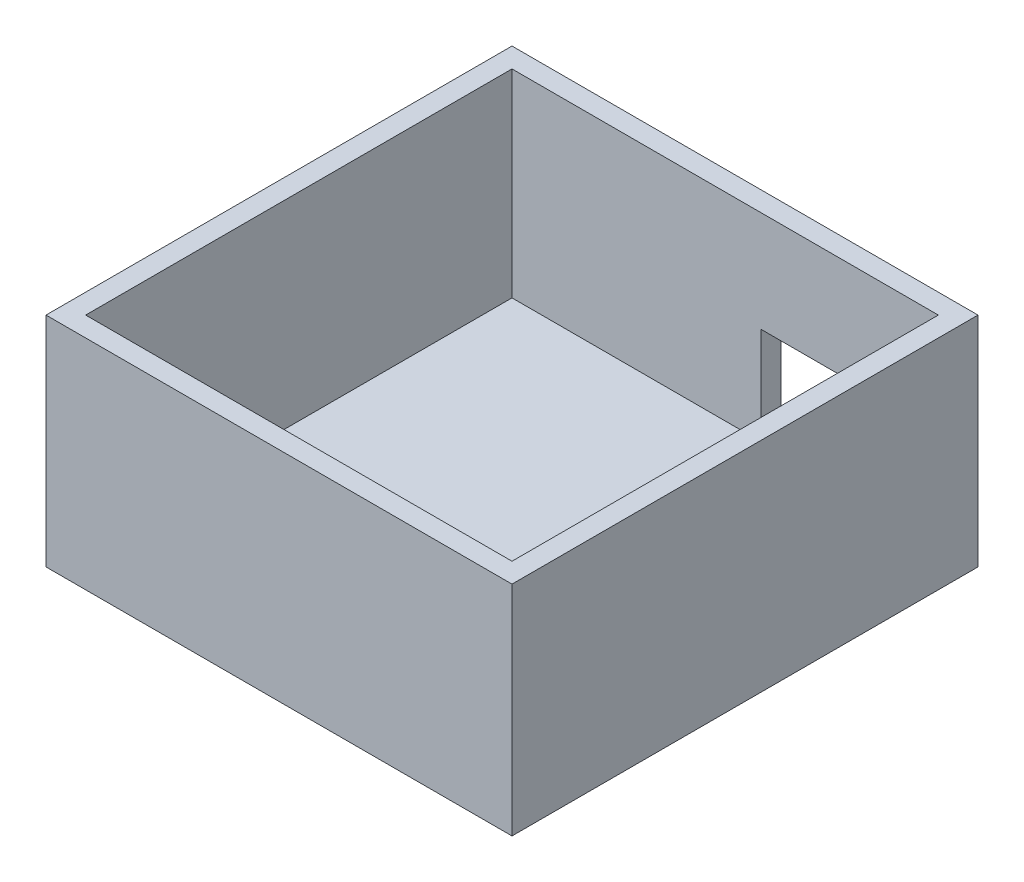
ISO-10303-21;
HEADER;
FILE_DESCRIPTION(('STEP AP214'),'2;1');
FILE_NAME('part.step','',(''),(''),'','','');
FILE_SCHEMA(('AUTOMOTIVE_DESIGN { 1 0 10303 214 1 1 1 1 }'));
ENDSEC;
DATA;
#1=APPLICATION_CONTEXT('core data for automotive mechanical design processes');
#2=APPLICATION_PROTOCOL_DEFINITION('international standard','automotive_design',2000,#1);
#3=PRODUCT_CONTEXT('',#1,'mechanical');
#4=PRODUCT('Part','Part','',(#3));
#5=PRODUCT_RELATED_PRODUCT_CATEGORY('part','',(#4));
#6=PRODUCT_DEFINITION_FORMATION('','',#4);
#7=PRODUCT_DEFINITION_CONTEXT('part definition',#1,'design');
#8=PRODUCT_DEFINITION('design','',#6,#7);
#9=PRODUCT_DEFINITION_SHAPE('','',#8);
#10=(LENGTH_UNIT() NAMED_UNIT(*) SI_UNIT(.MILLI.,.METRE.));
#11=(NAMED_UNIT(*) PLANE_ANGLE_UNIT() SI_UNIT($,.RADIAN.));
#12=(NAMED_UNIT(*) SI_UNIT($,.STERADIAN.) SOLID_ANGLE_UNIT());
#13=UNCERTAINTY_MEASURE_WITH_UNIT(LENGTH_MEASURE(1.E-05),#10,'distance_accuracy_value','');
#14=(GEOMETRIC_REPRESENTATION_CONTEXT(3) GLOBAL_UNCERTAINTY_ASSIGNED_CONTEXT((#13)) GLOBAL_UNIT_ASSIGNED_CONTEXT((#10,
#11,#12)) REPRESENTATION_CONTEXT('',''));
#15=CARTESIAN_POINT('',(0.,0.,0.));
#16=DIRECTION('',(0.,0.,1.));
#17=DIRECTION('',(1.,0.,0.));
#18=AXIS2_PLACEMENT_3D('',#15,#16,#17);
#19=CARTESIAN_POINT('',(0.,100.,-102.5));
#20=DIRECTION('',(0.,0.,-1.));
#21=DIRECTION('',(-1.,0.,0.));
#22=AXIS2_PLACEMENT_3D('',#19,#20,#21);
#23=PLANE('',#22);
#24=DIRECTION('',(-1.,0.,0.));
#25=VECTOR('',#24,1.);
#26=CARTESIAN_POINT('',(92.8750219372496,49.0699731582822,-102.5));
#27=LINE('',#26,#25);
#28=CARTESIAN_POINT('',(92.8750219372496,49.0699731582822,-102.5));
#29=VERTEX_POINT('',#28);
#30=CARTESIAN_POINT('',(18.1394624170998,49.0699731582822,-102.5));
#31=VERTEX_POINT('',#30);
#32=EDGE_CURVE('E129',#29,#31,#27,.T.);
#33=ORIENTED_EDGE('',*,*,#32,.F.);
#34=DIRECTION('',(0.,1.,0.));
#35=VECTOR('',#34,1.);
#36=CARTESIAN_POINT('',(92.8750219372496,49.0699731582822,-102.5));
#37=LINE('',#36,#35);
#38=CARTESIAN_POINT('',(92.8750219372496,8.69964188765948,-102.5));
#39=VERTEX_POINT('',#38);
#40=EDGE_CURVE('E136',#39,#29,#37,.T.);
#41=ORIENTED_EDGE('',*,*,#40,.F.);
#42=DIRECTION('',(1.,0.,0.));
#43=VECTOR('',#42,1.);
#44=CARTESIAN_POINT('',(92.8750219372496,8.69964188765948,-102.5));
#45=LINE('',#44,#43);
#46=CARTESIAN_POINT('',(18.1394624170998,8.69964188765948,-102.5));
#47=VERTEX_POINT('',#46);
#48=EDGE_CURVE('E141',#47,#39,#45,.T.);
#49=ORIENTED_EDGE('',*,*,#48,.F.);
#50=DIRECTION('',(0.,-1.,0.));
#51=VECTOR('',#50,1.);
#52=CARTESIAN_POINT('',(18.1394624170998,49.0699731582822,-102.5));
#53=LINE('',#52,#51);
#54=EDGE_CURVE('E51',#31,#47,#53,.T.);
#55=ORIENTED_EDGE('',*,*,#54,.F.);
#56=EDGE_LOOP('',(#33,#41,#49,#55));
#57=FACE_BOUND('',#56,.T.);
#58=DIRECTION('',(1.,0.,0.));
#59=VECTOR('',#58,1.);
#60=CARTESIAN_POINT('',(0.,0.,-102.5));
#61=LINE('',#60,#59);
#62=CARTESIAN_POINT('',(-107.5,0.,-102.5));
#63=VERTEX_POINT('',#62);
#64=CARTESIAN_POINT('',(107.5,0.,-102.5));
#65=VERTEX_POINT('',#64);
#66=EDGE_CURVE('E164',#63,#65,#61,.T.);
#67=ORIENTED_EDGE('',*,*,#66,.T.);
#68=DIRECTION('',(0.,-1.,0.));
#69=VECTOR('',#68,1.);
#70=CARTESIAN_POINT('',(107.5,100.,-102.5));
#71=LINE('',#70,#69);
#72=CARTESIAN_POINT('',(107.5,100.,-102.5));
#73=VERTEX_POINT('',#72);
#74=EDGE_CURVE('E11',#73,#65,#71,.T.);
#75=ORIENTED_EDGE('',*,*,#74,.F.);
#76=DIRECTION('',(1.,0.,0.));
#77=VECTOR('',#76,1.);
#78=CARTESIAN_POINT('',(0.,100.,-102.5));
#79=LINE('',#78,#77);
#80=CARTESIAN_POINT('',(-107.5,100.,-102.5));
#81=VERTEX_POINT('',#80);
#82=EDGE_CURVE('E177',#81,#73,#79,.T.);
#83=ORIENTED_EDGE('',*,*,#82,.F.);
#84=DIRECTION('',(0.,-1.,0.));
#85=VECTOR('',#84,1.);
#86=CARTESIAN_POINT('',(-107.5,100.,-102.5));
#87=LINE('',#86,#85);
#88=EDGE_CURVE('E197',#81,#63,#87,.T.);
#89=ORIENTED_EDGE('',*,*,#88,.T.);
#90=EDGE_LOOP('',(#67,#75,#83,#89));
#91=FACE_BOUND('',#90,.T.);
#92=ADVANCED_FACE('F34',(#57,#91),#23,.F.);
#93=CARTESIAN_POINT('',(107.5,100.,0.));
#94=DIRECTION('',(1.,0.,0.));
#95=DIRECTION('',(0.,0.,-1.));
#96=AXIS2_PLACEMENT_3D('',#93,#94,#95);
#97=PLANE('',#96);
#98=DIRECTION('',(0.,0.,1.));
#99=VECTOR('',#98,1.);
#100=CARTESIAN_POINT('',(107.5,0.,0.));
#101=LINE('',#100,#99);
#102=CARTESIAN_POINT('',(107.5,0.,112.5));
#103=VERTEX_POINT('',#102);
#104=EDGE_CURVE('E191',#65,#103,#101,.T.);
#105=ORIENTED_EDGE('',*,*,#104,.T.);
#106=DIRECTION('',(0.,-1.,0.));
#107=VECTOR('',#106,1.);
#108=CARTESIAN_POINT('',(107.5,100.,112.5));
#109=LINE('',#108,#107);
#110=CARTESIAN_POINT('',(107.5,100.,112.5));
#111=VERTEX_POINT('',#110);
#112=EDGE_CURVE('E43',#111,#103,#109,.T.);
#113=ORIENTED_EDGE('',*,*,#112,.F.);
#114=DIRECTION('',(0.,0.,1.));
#115=VECTOR('',#114,1.);
#116=CARTESIAN_POINT('',(107.5,100.,0.));
#117=LINE('',#116,#115);
#118=EDGE_CURVE('E180',#73,#111,#117,.T.);
#119=ORIENTED_EDGE('',*,*,#118,.F.);
#120=ORIENTED_EDGE('',*,*,#74,.T.);
#121=EDGE_LOOP('',(#105,#113,#119,#120));
#122=FACE_BOUND('',#121,.T.);
#123=ADVANCED_FACE('F239',(#122),#97,.F.);
#124=CARTESIAN_POINT('',(0.,100.,112.5));
#125=DIRECTION('',(0.,0.,-1.));
#126=DIRECTION('',(-1.,0.,0.));
#127=AXIS2_PLACEMENT_3D('',#124,#125,#126);
#128=PLANE('',#127);
#129=DIRECTION('',(1.,0.,0.));
#130=VECTOR('',#129,1.);
#131=CARTESIAN_POINT('',(0.,0.,112.5));
#132=LINE('',#131,#130);
#133=CARTESIAN_POINT('',(-107.5,0.,112.5));
#134=VERTEX_POINT('',#133);
#135=EDGE_CURVE('E194',#134,#103,#132,.T.);
#136=ORIENTED_EDGE('',*,*,#135,.F.);
#137=DIRECTION('',(0.,-1.,0.));
#138=VECTOR('',#137,1.);
#139=CARTESIAN_POINT('',(-107.5,100.,112.5));
#140=LINE('',#139,#138);
#141=CARTESIAN_POINT('',(-107.5,100.,112.5));
#142=VERTEX_POINT('',#141);
#143=EDGE_CURVE('E200',#142,#134,#140,.T.);
#144=ORIENTED_EDGE('',*,*,#143,.F.);
#145=DIRECTION('',(1.,0.,0.));
#146=VECTOR('',#145,1.);
#147=CARTESIAN_POINT('',(0.,100.,112.5));
#148=LINE('',#147,#146);
#149=EDGE_CURVE('E182',#142,#111,#148,.T.);
#150=ORIENTED_EDGE('',*,*,#149,.T.);
#151=ORIENTED_EDGE('',*,*,#112,.T.);
#152=EDGE_LOOP('',(#136,#144,#150,#151));
#153=FACE_BOUND('',#152,.T.);
#154=ADVANCED_FACE('F242',(#153),#128,.T.);
#155=CARTESIAN_POINT('',(117.5,100.,0.));
#156=DIRECTION('',(1.,0.,0.));
#157=DIRECTION('',(0.,0.,-1.));
#158=AXIS2_PLACEMENT_3D('',#155,#156,#157);
#159=PLANE('',#158);
#160=DIRECTION('',(0.,-1.,0.));
#161=VECTOR('',#160,1.);
#162=CARTESIAN_POINT('',(117.5,100.,122.5));
#163=LINE('',#162,#161);
#164=CARTESIAN_POINT('',(117.5,100.,122.5));
#165=VERTEX_POINT('',#164);
#166=CARTESIAN_POINT('',(117.5,-10.,122.5));
#167=VERTEX_POINT('',#166);
#168=EDGE_CURVE('E188',#165,#167,#163,.T.);
#169=ORIENTED_EDGE('',*,*,#168,.T.);
#170=DIRECTION('',(0.,0.,1.));
#171=VECTOR('',#170,1.);
#172=CARTESIAN_POINT('',(117.5,-10.,122.5));
#173=LINE('',#172,#171);
#174=CARTESIAN_POINT('',(117.5,-10.,-112.5));
#175=VERTEX_POINT('',#174);
#176=EDGE_CURVE('E158',#175,#167,#173,.T.);
#177=ORIENTED_EDGE('',*,*,#176,.F.);
#178=DIRECTION('',(0.,-1.,0.));
#179=VECTOR('',#178,1.);
#180=CARTESIAN_POINT('',(117.5,100.,-112.5));
#181=LINE('',#180,#179);
#182=CARTESIAN_POINT('',(117.5,100.,-112.5));
#183=VERTEX_POINT('',#182);
#184=EDGE_CURVE('E38',#183,#175,#181,.T.);
#185=ORIENTED_EDGE('',*,*,#184,.F.);
#186=DIRECTION('',(0.,0.,1.));
#187=VECTOR('',#186,1.);
#188=CARTESIAN_POINT('',(117.5,100.,0.));
#189=LINE('',#188,#187);
#190=EDGE_CURVE('E165',#183,#165,#189,.T.);
#191=ORIENTED_EDGE('',*,*,#190,.T.);
#192=EDGE_LOOP('',(#169,#177,#185,#191));
#193=FACE_BOUND('',#192,.T.);
#194=ADVANCED_FACE('F36',(#193),#159,.T.);
#195=CARTESIAN_POINT('',(0.,100.,-112.5));
#196=DIRECTION('',(0.,0.,-1.));
#197=DIRECTION('',(-1.,0.,0.));
#198=AXIS2_PLACEMENT_3D('',#195,#196,#197);
#199=PLANE('',#198);
#200=DIRECTION('',(0.,-1.,0.));
#201=VECTOR('',#200,1.);
#202=CARTESIAN_POINT('',(92.8750219372496,49.0699731582822,-112.5));
#203=LINE('',#202,#201);
#204=CARTESIAN_POINT('',(92.8750219372496,49.0699731582822,-112.5));
#205=VERTEX_POINT('',#204);
#206=CARTESIAN_POINT('',(92.8750219372496,8.69964188765948,-112.5));
#207=VERTEX_POINT('',#206);
#208=EDGE_CURVE('E59',#205,#207,#203,.T.);
#209=ORIENTED_EDGE('',*,*,#208,.F.);
#210=DIRECTION('',(1.,0.,0.));
#211=VECTOR('',#210,1.);
#212=CARTESIAN_POINT('',(92.8750219372496,49.0699731582822,-112.5));
#213=LINE('',#212,#211);
#214=CARTESIAN_POINT('',(18.1394624170998,49.0699731582822,-112.5));
#215=VERTEX_POINT('',#214);
#216=EDGE_CURVE('E131',#215,#205,#213,.T.);
#217=ORIENTED_EDGE('',*,*,#216,.F.);
#218=DIRECTION('',(0.,1.,0.));
#219=VECTOR('',#218,1.);
#220=CARTESIAN_POINT('',(18.1394624170998,49.0699731582822,-112.5));
#221=LINE('',#220,#219);
#222=CARTESIAN_POINT('',(18.1394624170998,8.69964188765948,-112.5));
#223=VERTEX_POINT('',#222);
#224=EDGE_CURVE('E272',#223,#215,#221,.T.);
#225=ORIENTED_EDGE('',*,*,#224,.F.);
#226=DIRECTION('',(-1.,0.,0.));
#227=VECTOR('',#226,1.);
#228=CARTESIAN_POINT('',(92.8750219372496,8.69964188765948,-112.5));
#229=LINE('',#228,#227);
#230=EDGE_CURVE('E271',#207,#223,#229,.T.);
#231=ORIENTED_EDGE('',*,*,#230,.F.);
#232=EDGE_LOOP('',(#209,#217,#225,#231));
#233=FACE_BOUND('',#232,.T.);
#234=ORIENTED_EDGE('',*,*,#184,.T.);
#235=DIRECTION('',(1.,0.,0.));
#236=VECTOR('',#235,1.);
#237=CARTESIAN_POINT('',(-117.5,-10.,-112.5));
#238=LINE('',#237,#236);
#239=CARTESIAN_POINT('',(-117.5,-10.,-112.5));
#240=VERTEX_POINT('',#239);
#241=EDGE_CURVE('E155',#240,#175,#238,.T.);
#242=ORIENTED_EDGE('',*,*,#241,.F.);
#243=DIRECTION('',(0.,-1.,0.));
#244=VECTOR('',#243,1.);
#245=CARTESIAN_POINT('',(-117.5,100.,-112.5));
#246=LINE('',#245,#244);
#247=CARTESIAN_POINT('',(-117.5,100.,-112.5));
#248=VERTEX_POINT('',#247);
#249=EDGE_CURVE('E207',#248,#240,#246,.T.);
#250=ORIENTED_EDGE('',*,*,#249,.F.);
#251=DIRECTION('',(1.,0.,0.));
#252=VECTOR('',#251,1.);
#253=CARTESIAN_POINT('',(0.,100.,-112.5));
#254=LINE('',#253,#252);
#255=EDGE_CURVE('E168',#248,#183,#254,.T.);
#256=ORIENTED_EDGE('',*,*,#255,.T.);
#257=EDGE_LOOP('',(#234,#242,#250,#256));
#258=FACE_BOUND('',#257,.T.);
#259=ADVANCED_FACE('F212',(#233,#258),#199,.T.);
#260=CARTESIAN_POINT('',(-117.5,100.,0.));
#261=DIRECTION('',(-1.,0.,0.));
#262=DIRECTION('',(0.,0.,1.));
#263=AXIS2_PLACEMENT_3D('',#260,#261,#262);
#264=PLANE('',#263);
#265=ORIENTED_EDGE('',*,*,#249,.T.);
#266=DIRECTION('',(0.,0.,-1.));
#267=VECTOR('',#266,1.);
#268=CARTESIAN_POINT('',(-117.5,-10.,122.5));
#269=LINE('',#268,#267);
#270=CARTESIAN_POINT('',(-117.5,-10.,122.5));
#271=VERTEX_POINT('',#270);
#272=EDGE_CURVE('E145',#271,#240,#269,.T.);
#273=ORIENTED_EDGE('',*,*,#272,.F.);
#274=DIRECTION('',(0.,-1.,0.));
#275=VECTOR('',#274,1.);
#276=CARTESIAN_POINT('',(-117.5,100.,122.5));
#277=LINE('',#276,#275);
#278=CARTESIAN_POINT('',(-117.5,100.,122.5));
#279=VERTEX_POINT('',#278);
#280=EDGE_CURVE('E206',#279,#271,#277,.T.);
#281=ORIENTED_EDGE('',*,*,#280,.F.);
#282=DIRECTION('',(0.,0.,-1.));
#283=VECTOR('',#282,1.);
#284=CARTESIAN_POINT('',(-117.5,100.,0.));
#285=LINE('',#284,#283);
#286=EDGE_CURVE('E172',#279,#248,#285,.T.);
#287=ORIENTED_EDGE('',*,*,#286,.T.);
#288=EDGE_LOOP('',(#265,#273,#281,#287));
#289=FACE_BOUND('',#288,.T.);
#290=ADVANCED_FACE('F225',(#289),#264,.T.);
#291=CARTESIAN_POINT('',(0.,100.,122.5));
#292=DIRECTION('',(0.,0.,-1.));
#293=DIRECTION('',(-1.,0.,0.));
#294=AXIS2_PLACEMENT_3D('',#291,#292,#293);
#295=PLANE('',#294);
#296=ORIENTED_EDGE('',*,*,#280,.T.);
#297=DIRECTION('',(-1.,0.,0.));
#298=VECTOR('',#297,1.);
#299=CARTESIAN_POINT('',(-117.5,-10.,122.5));
#300=LINE('',#299,#298);
#301=EDGE_CURVE('E161',#167,#271,#300,.T.);
#302=ORIENTED_EDGE('',*,*,#301,.F.);
#303=ORIENTED_EDGE('',*,*,#168,.F.);
#304=DIRECTION('',(1.,0.,0.));
#305=VECTOR('',#304,1.);
#306=CARTESIAN_POINT('',(0.,100.,122.5));
#307=LINE('',#306,#305);
#308=EDGE_CURVE('E175',#279,#165,#307,.T.);
#309=ORIENTED_EDGE('',*,*,#308,.F.);
#310=EDGE_LOOP('',(#296,#302,#303,#309));
#311=FACE_BOUND('',#310,.T.);
#312=ADVANCED_FACE('F223',(#311),#295,.F.);
#313=CARTESIAN_POINT('',(-107.5,100.,0.));
#314=DIRECTION('',(1.,0.,0.));
#315=DIRECTION('',(0.,0.,-1.));
#316=AXIS2_PLACEMENT_3D('',#313,#314,#315);
#317=PLANE('',#316);
#318=DIRECTION('',(0.,0.,1.));
#319=VECTOR('',#318,1.);
#320=CARTESIAN_POINT('',(-107.5,0.,0.));
#321=LINE('',#320,#319);
#322=EDGE_CURVE('E169',#63,#134,#321,.T.);
#323=ORIENTED_EDGE('',*,*,#322,.F.);
#324=ORIENTED_EDGE('',*,*,#88,.F.);
#325=DIRECTION('',(0.,0.,1.));
#326=VECTOR('',#325,1.);
#327=CARTESIAN_POINT('',(-107.5,100.,0.));
#328=LINE('',#327,#326);
#329=EDGE_CURVE('E185',#81,#142,#328,.T.);
#330=ORIENTED_EDGE('',*,*,#329,.T.);
#331=ORIENTED_EDGE('',*,*,#143,.T.);
#332=EDGE_LOOP('',(#323,#324,#330,#331));
#333=FACE_BOUND('',#332,.T.);
#334=ADVANCED_FACE('F231',(#333),#317,.T.);
#335=CARTESIAN_POINT('',(0.,100.,0.));
#336=DIRECTION('',(0.,1.,0.));
#337=DIRECTION('',(0.,0.,1.));
#338=AXIS2_PLACEMENT_3D('',#335,#336,#337);
#339=PLANE('',#338);
#340=ORIENTED_EDGE('',*,*,#190,.F.);
#341=ORIENTED_EDGE('',*,*,#255,.F.);
#342=ORIENTED_EDGE('',*,*,#286,.F.);
#343=ORIENTED_EDGE('',*,*,#308,.T.);
#344=EDGE_LOOP('',(#340,#341,#342,#343));
#345=FACE_BOUND('',#344,.T.);
#346=ORIENTED_EDGE('',*,*,#82,.T.);
#347=ORIENTED_EDGE('',*,*,#118,.T.);
#348=ORIENTED_EDGE('',*,*,#149,.F.);
#349=ORIENTED_EDGE('',*,*,#329,.F.);
#350=EDGE_LOOP('',(#346,#347,#348,#349));
#351=FACE_BOUND('',#350,.T.);
#352=ADVANCED_FACE('F227',(#345,#351),#339,.T.);
#353=CARTESIAN_POINT('',(0.,0.,0.));
#354=DIRECTION('',(0.,-1.,0.));
#355=DIRECTION('',(0.,0.,-1.));
#356=AXIS2_PLACEMENT_3D('',#353,#354,#355);
#357=PLANE('',#356);
#358=ORIENTED_EDGE('',*,*,#66,.F.);
#359=ORIENTED_EDGE('',*,*,#322,.T.);
#360=ORIENTED_EDGE('',*,*,#135,.T.);
#361=ORIENTED_EDGE('',*,*,#104,.F.);
#362=EDGE_LOOP('',(#358,#359,#360,#361));
#363=FACE_BOUND('',#362,.T.);
#364=ADVANCED_FACE('F230',(#363),#357,.F.);
#365=CARTESIAN_POINT('',(0.,-10.,0.));
#366=DIRECTION('',(0.,-1.,0.));
#367=DIRECTION('',(0.,0.,-1.));
#368=AXIS2_PLACEMENT_3D('',#365,#366,#367);
#369=PLANE('',#368);
#370=ORIENTED_EDGE('',*,*,#272,.T.);
#371=ORIENTED_EDGE('',*,*,#241,.T.);
#372=ORIENTED_EDGE('',*,*,#176,.T.);
#373=ORIENTED_EDGE('',*,*,#301,.T.);
#374=EDGE_LOOP('',(#370,#371,#372,#373));
#375=FACE_BOUND('',#374,.T.);
#376=ADVANCED_FACE('F218',(#375),#369,.T.);
#377=CARTESIAN_POINT('',(92.8750219372496,49.0699731582822,122.501));
#378=DIRECTION('',(1.,0.,0.));
#379=DIRECTION('',(0.,0.,-1.));
#380=AXIS2_PLACEMENT_3D('',#377,#378,#379);
#381=PLANE('',#380);
#382=ORIENTED_EDGE('',*,*,#40,.T.);
#383=DIRECTION('',(0.,0.,-1.));
#384=VECTOR('',#383,1.);
#385=CARTESIAN_POINT('',(92.8750219372496,49.0699731582822,122.501));
#386=LINE('',#385,#384);
#387=EDGE_CURVE('E125',#29,#205,#386,.T.);
#388=ORIENTED_EDGE('',*,*,#387,.T.);
#389=ORIENTED_EDGE('',*,*,#208,.T.);
#390=DIRECTION('',(0.,0.,-1.));
#391=VECTOR('',#390,1.);
#392=CARTESIAN_POINT('',(92.8750219372496,8.69964188765948,122.501));
#393=LINE('',#392,#391);
#394=EDGE_CURVE('E133',#39,#207,#393,.T.);
#395=ORIENTED_EDGE('',*,*,#394,.F.);
#396=EDGE_LOOP('',(#382,#388,#389,#395));
#397=FACE_BOUND('',#396,.T.);
#398=ADVANCED_FACE('F137',(#397),#381,.F.);
#399=CARTESIAN_POINT('',(92.8750219372496,49.0699731582822,122.501));
#400=DIRECTION('',(0.,1.,0.));
#401=DIRECTION('',(0.,0.,1.));
#402=AXIS2_PLACEMENT_3D('',#399,#400,#401);
#403=PLANE('',#402);
#404=ORIENTED_EDGE('',*,*,#32,.T.);
#405=DIRECTION('',(0.,0.,-1.));
#406=VECTOR('',#405,1.);
#407=CARTESIAN_POINT('',(18.1394624170998,49.0699731582822,122.501));
#408=LINE('',#407,#406);
#409=EDGE_CURVE('E132',#31,#215,#408,.T.);
#410=ORIENTED_EDGE('',*,*,#409,.T.);
#411=ORIENTED_EDGE('',*,*,#216,.T.);
#412=ORIENTED_EDGE('',*,*,#387,.F.);
#413=EDGE_LOOP('',(#404,#410,#411,#412));
#414=FACE_BOUND('',#413,.T.);
#415=ADVANCED_FACE('F127',(#414),#403,.F.);
#416=CARTESIAN_POINT('',(18.1394624170998,49.0699731582822,122.501));
#417=DIRECTION('',(-1.,0.,0.));
#418=DIRECTION('',(0.,0.,1.));
#419=AXIS2_PLACEMENT_3D('',#416,#417,#418);
#420=PLANE('',#419);
#421=ORIENTED_EDGE('',*,*,#54,.T.);
#422=DIRECTION('',(0.,0.,-1.));
#423=VECTOR('',#422,1.);
#424=CARTESIAN_POINT('',(18.1394624170998,8.69964188765948,122.501));
#425=LINE('',#424,#423);
#426=EDGE_CURVE('E150',#47,#223,#425,.T.);
#427=ORIENTED_EDGE('',*,*,#426,.T.);
#428=ORIENTED_EDGE('',*,*,#224,.T.);
#429=ORIENTED_EDGE('',*,*,#409,.F.);
#430=EDGE_LOOP('',(#421,#427,#428,#429));
#431=FACE_BOUND('',#430,.T.);
#432=ADVANCED_FACE('F280',(#431),#420,.F.);
#433=CARTESIAN_POINT('',(92.8750219372496,8.69964188765948,122.501));
#434=DIRECTION('',(0.,-1.,0.));
#435=DIRECTION('',(0.,0.,-1.));
#436=AXIS2_PLACEMENT_3D('',#433,#434,#435);
#437=PLANE('',#436);
#438=ORIENTED_EDGE('',*,*,#48,.T.);
#439=ORIENTED_EDGE('',*,*,#394,.T.);
#440=ORIENTED_EDGE('',*,*,#230,.T.);
#441=ORIENTED_EDGE('',*,*,#426,.F.);
#442=EDGE_LOOP('',(#438,#439,#440,#441));
#443=FACE_BOUND('',#442,.T.);
#444=ADVANCED_FACE('F279',(#443),#437,.F.);
#445=CLOSED_SHELL('',(#92,#123,#154,#194,#259,#290,#312,#334,#352,#364,#376,#398,#415,#432,#444));
#446=MANIFOLD_SOLID_BREP('B2',#445);
#447=ADVANCED_BREP_SHAPE_REPRESENTATION('',(#18,#446),#14);
#448=SHAPE_DEFINITION_REPRESENTATION(#9,#447);
ENDSEC;
END-ISO-10303-21;
